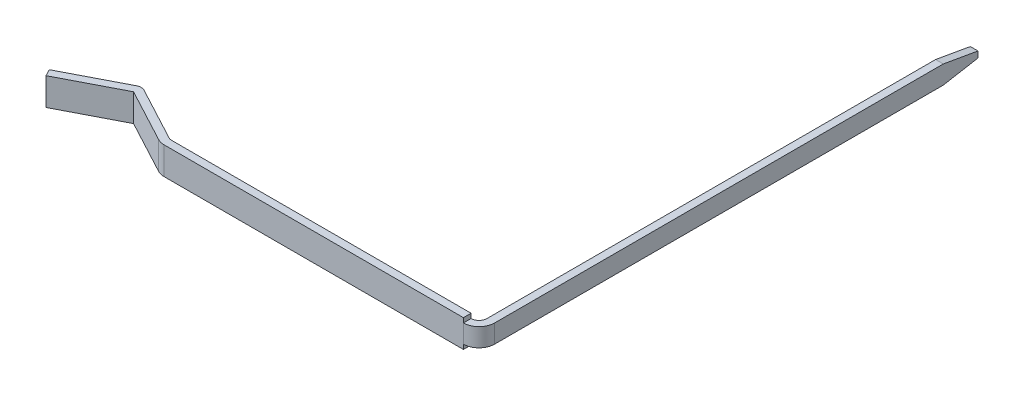
ISO-10303-21;
HEADER;
FILE_DESCRIPTION(('STEP AP214'),'2;1');
FILE_NAME('part.step','',(''),(''),'','','');
FILE_SCHEMA(('AUTOMOTIVE_DESIGN { 1 0 10303 214 1 1 1 1 }'));
ENDSEC;
DATA;
#1=APPLICATION_CONTEXT('core data for automotive mechanical design processes');
#2=APPLICATION_PROTOCOL_DEFINITION('international standard','automotive_design',2000,#1);
#3=PRODUCT_CONTEXT('',#1,'mechanical');
#4=PRODUCT('Part','Part','',(#3));
#5=PRODUCT_RELATED_PRODUCT_CATEGORY('part','',(#4));
#6=PRODUCT_DEFINITION_FORMATION('','',#4);
#7=PRODUCT_DEFINITION_CONTEXT('part definition',#1,'design');
#8=PRODUCT_DEFINITION('design','',#6,#7);
#9=PRODUCT_DEFINITION_SHAPE('','',#8);
#10=(LENGTH_UNIT() NAMED_UNIT(*) SI_UNIT(.MILLI.,.METRE.));
#11=(NAMED_UNIT(*) PLANE_ANGLE_UNIT() SI_UNIT($,.RADIAN.));
#12=(NAMED_UNIT(*) SI_UNIT($,.STERADIAN.) SOLID_ANGLE_UNIT());
#13=UNCERTAINTY_MEASURE_WITH_UNIT(LENGTH_MEASURE(1.E-05),#10,'distance_accuracy_value','');
#14=(GEOMETRIC_REPRESENTATION_CONTEXT(3) GLOBAL_UNCERTAINTY_ASSIGNED_CONTEXT((#13)) GLOBAL_UNIT_ASSIGNED_CONTEXT((#10,
#11,#12)) REPRESENTATION_CONTEXT('',''));
#15=CARTESIAN_POINT('',(0.,0.,0.));
#16=DIRECTION('',(0.,0.,1.));
#17=DIRECTION('',(1.,0.,0.));
#18=AXIS2_PLACEMENT_3D('',#15,#16,#17);
#19=CARTESIAN_POINT('',(5.145,-0.1,-7.89));
#20=DIRECTION('',(0.,0.,-1.));
#21=DIRECTION('',(0.,1.,0.));
#22=AXIS2_PLACEMENT_3D('',#19,#20,#21);
#23=PLANE('',#22);
#24=DIRECTION('',(0.,1.,0.));
#25=VECTOR('',#24,1.);
#26=CARTESIAN_POINT('',(5.395,0.,-7.89));
#27=LINE('',#26,#25);
#28=CARTESIAN_POINT('',(5.395,-0.099999999999998,-7.89));
#29=VERTEX_POINT('',#28);
#30=CARTESIAN_POINT('',(5.395,0.100000000000001,-7.89));
#31=VERTEX_POINT('',#30);
#32=EDGE_CURVE('E128',#29,#31,#27,.T.);
#33=ORIENTED_EDGE('',*,*,#32,.F.);
#34=DIRECTION('',(1.,0.,0.));
#35=VECTOR('',#34,1.);
#36=CARTESIAN_POINT('',(5.27,-0.1,-7.89));
#37=LINE('',#36,#35);
#38=CARTESIAN_POINT('',(5.145,-0.100000000000001,-7.89));
#39=VERTEX_POINT('',#38);
#40=EDGE_CURVE('E144',#39,#29,#37,.T.);
#41=ORIENTED_EDGE('',*,*,#40,.F.);
#42=DIRECTION('',(0.,-1.,0.));
#43=VECTOR('',#42,1.);
#44=CARTESIAN_POINT('',(5.145,0.,-7.89));
#45=LINE('',#44,#43);
#46=CARTESIAN_POINT('',(5.145,0.100000000000001,-7.89));
#47=VERTEX_POINT('',#46);
#48=EDGE_CURVE('E147',#47,#39,#45,.T.);
#49=ORIENTED_EDGE('',*,*,#48,.F.);
#50=DIRECTION('',(-1.,0.,0.));
#51=VECTOR('',#50,1.);
#52=CARTESIAN_POINT('',(5.27,0.1,-7.89));
#53=LINE('',#52,#51);
#54=EDGE_CURVE('E151',#31,#47,#53,.T.);
#55=ORIENTED_EDGE('',*,*,#54,.F.);
#56=EDGE_LOOP('',(#33,#41,#49,#55));
#57=FACE_BOUND('',#56,.T.);
#58=ADVANCED_FACE('F15',(#57),#23,.T.);
#59=CARTESIAN_POINT('',(5.395,-0.30000000000001,-6.75574363607643));
#60=DIRECTION('',(0.,-0.984807753012207,-0.173648177666935));
#61=DIRECTION('',(-1.,0.,0.));
#62=AXIS2_PLACEMENT_3D('',#59,#60,#61);
#63=PLANE('',#62);
#64=DIRECTION('',(0.,0.173648177666945,-0.984807753012205));
#65=VECTOR('',#64,1.);
#66=CARTESIAN_POINT('',(5.395,-0.3,-6.75574363607653));
#67=LINE('',#66,#65);
#68=CARTESIAN_POINT('',(5.395,-0.3,-6.75574363607652));
#69=VERTEX_POINT('',#68);
#70=EDGE_CURVE('E121',#69,#29,#67,.T.);
#71=ORIENTED_EDGE('',*,*,#70,.F.);
#72=DIRECTION('',(1.,0.,0.));
#73=VECTOR('',#72,1.);
#74=CARTESIAN_POINT('',(5.14,-0.3,-6.75574363607651));
#75=LINE('',#74,#73);
#76=CARTESIAN_POINT('',(5.145,-0.3,-6.75574363607645));
#77=VERTEX_POINT('',#76);
#78=EDGE_CURVE('E113',#77,#69,#75,.T.);
#79=ORIENTED_EDGE('',*,*,#78,.F.);
#80=DIRECTION('',(0.,-0.173648177666916,0.984807753012211));
#81=VECTOR('',#80,1.);
#82=CARTESIAN_POINT('',(5.145,-0.100000000000002,-7.89));
#83=LINE('',#82,#81);
#84=EDGE_CURVE('E141',#39,#77,#83,.T.);
#85=ORIENTED_EDGE('',*,*,#84,.F.);
#86=ORIENTED_EDGE('',*,*,#40,.T.);
#87=EDGE_LOOP('',(#71,#79,#85,#86));
#88=FACE_BOUND('',#87,.T.);
#89=ADVANCED_FACE('F234',(#88),#63,.T.);
#90=CARTESIAN_POINT('',(4.885,-0.3,8.49093446181646));
#91=DIRECTION('',(0.,-1.,0.));
#92=DIRECTION('',(0.,0.,-1.));
#93=AXIS2_PLACEMENT_3D('',#90,#91,#92);
#94=PLANE('',#93);
#95=DIRECTION('',(0.,0.,-1.));
#96=VECTOR('',#95,1.);
#97=CARTESIAN_POINT('',(4.885,-0.3,0.867595412869975));
#98=LINE('',#97,#96);
#99=CARTESIAN_POINT('',(4.885,-0.299999999999998,8.4));
#100=VERTEX_POINT('',#99);
#101=CARTESIAN_POINT('',(4.885,-0.299999999999999,8.15));
#102=VERTEX_POINT('',#101);
#103=EDGE_CURVE('E112',#100,#102,#98,.T.);
#104=ORIENTED_EDGE('',*,*,#103,.T.);
#105=CARTESIAN_POINT('',(4.885,-0.3,7.89));
#106=DIRECTION('',(0.,-1.,0.));
#107=DIRECTION('',(1.,0.,0.));
#108=AXIS2_PLACEMENT_3D('',#105,#106,#107);
#109=CIRCLE('',#108,0.260000000000001);
#110=CARTESIAN_POINT('',(5.145,-0.3,7.89));
#111=VERTEX_POINT('',#110);
#112=EDGE_CURVE('E131',#102,#111,#109,.F.);
#113=ORIENTED_EDGE('',*,*,#112,.T.);
#114=DIRECTION('',(0.,0.,1.));
#115=VECTOR('',#114,1.);
#116=CARTESIAN_POINT('',(5.145,-0.3,0.));
#117=LINE('',#116,#115);
#118=EDGE_CURVE('E137',#77,#111,#117,.T.);
#119=ORIENTED_EDGE('',*,*,#118,.F.);
#120=ORIENTED_EDGE('',*,*,#78,.T.);
#121=DIRECTION('',(0.,0.,-1.));
#122=VECTOR('',#121,1.);
#123=CARTESIAN_POINT('',(5.395,-0.3,0.));
#124=LINE('',#123,#122);
#125=CARTESIAN_POINT('',(5.395,-0.3,7.89));
#126=VERTEX_POINT('',#125);
#127=EDGE_CURVE('E115',#126,#69,#124,.T.);
#128=ORIENTED_EDGE('',*,*,#127,.F.);
#129=CARTESIAN_POINT('',(4.885,-0.3,7.89));
#130=DIRECTION('',(0.,-1.,0.));
#131=DIRECTION('',(0.,0.,-1.));
#132=AXIS2_PLACEMENT_3D('',#129,#130,#131);
#133=CIRCLE('',#132,0.510000000000001);
#134=EDGE_CURVE('E19',#126,#100,#133,.T.);
#135=ORIENTED_EDGE('',*,*,#134,.T.);
#136=EDGE_LOOP('',(#104,#113,#119,#120,#128,#135));
#137=FACE_BOUND('',#136,.T.);
#138=ADVANCED_FACE('F116',(#137),#94,.T.);
#139=CARTESIAN_POINT('',(5.395,-0.3,7.89));
#140=DIRECTION('',(1.,0.,0.));
#141=DIRECTION('',(0.,0.,-1.));
#142=AXIS2_PLACEMENT_3D('',#139,#140,#141);
#143=PLANE('',#142);
#144=ORIENTED_EDGE('',*,*,#127,.T.);
#145=ORIENTED_EDGE('',*,*,#70,.T.);
#146=ORIENTED_EDGE('',*,*,#32,.T.);
#147=DIRECTION('',(0.,-0.173648177666926,-0.984807753012209));
#148=VECTOR('',#147,1.);
#149=CARTESIAN_POINT('',(5.395,0.2,-7.32287181803822));
#150=LINE('',#149,#148);
#151=CARTESIAN_POINT('',(5.395,0.299999999999998,-6.75574363607646));
#152=VERTEX_POINT('',#151);
#153=EDGE_CURVE('E153',#152,#31,#150,.T.);
#154=ORIENTED_EDGE('',*,*,#153,.F.);
#155=DIRECTION('',(0.,0.,-1.));
#156=VECTOR('',#155,1.);
#157=CARTESIAN_POINT('',(5.395,0.3,0.86759541287));
#158=LINE('',#157,#156);
#159=CARTESIAN_POINT('',(5.395,0.3,7.89));
#160=VERTEX_POINT('',#159);
#161=EDGE_CURVE('E126',#160,#152,#158,.T.);
#162=ORIENTED_EDGE('',*,*,#161,.F.);
#163=DIRECTION('',(0.,-1.,0.));
#164=VECTOR('',#163,1.);
#165=CARTESIAN_POINT('',(5.395,0.,7.89));
#166=LINE('',#165,#164);
#167=EDGE_CURVE('E106',#160,#126,#166,.T.);
#168=ORIENTED_EDGE('',*,*,#167,.T.);
#169=EDGE_LOOP('',(#144,#145,#146,#154,#162,#168));
#170=FACE_BOUND('',#169,.T.);
#171=ADVANCED_FACE('F123',(#170),#143,.T.);
#172=CARTESIAN_POINT('',(5.395,0.1,-7.89));
#173=DIRECTION('',(0.,0.984807753012209,-0.173648177666926));
#174=DIRECTION('',(-1.,0.,0.));
#175=AXIS2_PLACEMENT_3D('',#172,#173,#174);
#176=PLANE('',#175);
#177=ORIENTED_EDGE('',*,*,#153,.T.);
#178=ORIENTED_EDGE('',*,*,#54,.T.);
#179=DIRECTION('',(0.,-0.173648177666916,-0.984807753012211));
#180=VECTOR('',#179,1.);
#181=CARTESIAN_POINT('',(5.145,0.3,-6.75574363607637));
#182=LINE('',#181,#180);
#183=CARTESIAN_POINT('',(5.145,0.299999999999996,-6.75574363607642));
#184=VERTEX_POINT('',#183);
#185=EDGE_CURVE('E150',#184,#47,#182,.T.);
#186=ORIENTED_EDGE('',*,*,#185,.F.);
#187=DIRECTION('',(-1.,0.,0.));
#188=VECTOR('',#187,1.);
#189=CARTESIAN_POINT('',(5.14,0.3,-6.75574363607646));
#190=LINE('',#189,#188);
#191=EDGE_CURVE('E243',#152,#184,#190,.T.);
#192=ORIENTED_EDGE('',*,*,#191,.F.);
#193=EDGE_LOOP('',(#177,#178,#186,#192));
#194=FACE_BOUND('',#193,.T.);
#195=ADVANCED_FACE('F241',(#194),#176,.T.);
#196=CARTESIAN_POINT('',(5.145,-0.3,-7.89));
#197=DIRECTION('',(-1.,0.,0.));
#198=DIRECTION('',(0.,0.,1.));
#199=AXIS2_PLACEMENT_3D('',#196,#197,#198);
#200=PLANE('',#199);
#201=ORIENTED_EDGE('',*,*,#118,.T.);
#202=DIRECTION('',(0.,1.,0.));
#203=VECTOR('',#202,1.);
#204=CARTESIAN_POINT('',(5.145,0.,7.89));
#205=LINE('',#204,#203);
#206=CARTESIAN_POINT('',(5.145,0.3,7.89));
#207=VERTEX_POINT('',#206);
#208=EDGE_CURVE('E140',#111,#207,#205,.T.);
#209=ORIENTED_EDGE('',*,*,#208,.T.);
#210=DIRECTION('',(0.,0.,1.));
#211=VECTOR('',#210,1.);
#212=CARTESIAN_POINT('',(5.145,0.3,0.86759541287));
#213=LINE('',#212,#211);
#214=EDGE_CURVE('E215',#184,#207,#213,.T.);
#215=ORIENTED_EDGE('',*,*,#214,.F.);
#216=ORIENTED_EDGE('',*,*,#185,.T.);
#217=ORIENTED_EDGE('',*,*,#48,.T.);
#218=ORIENTED_EDGE('',*,*,#84,.T.);
#219=EDGE_LOOP('',(#201,#209,#215,#216,#217,#218));
#220=FACE_BOUND('',#219,.T.);
#221=ADVANCED_FACE('F230',(#220),#200,.T.);
#222=CARTESIAN_POINT('',(4.885,0.3,-6.75574363607646));
#223=DIRECTION('',(0.,1.,0.));
#224=DIRECTION('',(0.,0.,1.));
#225=AXIS2_PLACEMENT_3D('',#222,#223,#224);
#226=PLANE('',#225);
#227=DIRECTION('',(0.,0.,-1.));
#228=VECTOR('',#227,1.);
#229=CARTESIAN_POINT('',(4.885,0.3,8.275));
#230=LINE('',#229,#228);
#231=CARTESIAN_POINT('',(4.885,0.299999999999999,8.4));
#232=VERTEX_POINT('',#231);
#233=CARTESIAN_POINT('',(4.885,0.299999999999999,8.15));
#234=VERTEX_POINT('',#233);
#235=EDGE_CURVE('E211',#232,#234,#230,.T.);
#236=ORIENTED_EDGE('',*,*,#235,.F.);
#237=CARTESIAN_POINT('',(4.885,0.3,7.89));
#238=DIRECTION('',(0.,-1.,0.));
#239=DIRECTION('',(0.,0.,-1.));
#240=AXIS2_PLACEMENT_3D('',#237,#238,#239);
#241=CIRCLE('',#240,0.510000000000001);
#242=EDGE_CURVE('E209',#160,#232,#241,.T.);
#243=ORIENTED_EDGE('',*,*,#242,.F.);
#244=ORIENTED_EDGE('',*,*,#161,.T.);
#245=ORIENTED_EDGE('',*,*,#191,.T.);
#246=ORIENTED_EDGE('',*,*,#214,.T.);
#247=CARTESIAN_POINT('',(4.885,0.3,7.89));
#248=DIRECTION('',(0.,-1.,0.));
#249=DIRECTION('',(1.,0.,0.));
#250=AXIS2_PLACEMENT_3D('',#247,#248,#249);
#251=CIRCLE('',#250,0.260000000000001);
#252=EDGE_CURVE('E212',#234,#207,#251,.F.);
#253=ORIENTED_EDGE('',*,*,#252,.F.);
#254=EDGE_LOOP('',(#236,#243,#244,#245,#246,#253));
#255=FACE_BOUND('',#254,.T.);
#256=ADVANCED_FACE('F423',(#255),#226,.T.);
#257=CARTESIAN_POINT('',(4.885,0.36,7.89));
#258=DIRECTION('',(0.,-1.,0.));
#259=DIRECTION('',(1.,0.,0.));
#260=AXIS2_PLACEMENT_3D('',#257,#258,#259);
#261=CYLINDRICAL_SURFACE('',#260,0.260000000000001);
#262=ORIENTED_EDGE('',*,*,#112,.F.);
#263=DIRECTION('',(0.,-1.,0.));
#264=VECTOR('',#263,1.);
#265=CARTESIAN_POINT('',(4.885,0.,8.15));
#266=LINE('',#265,#264);
#267=EDGE_CURVE('E252',#234,#102,#266,.T.);
#268=ORIENTED_EDGE('',*,*,#267,.F.);
#269=ORIENTED_EDGE('',*,*,#252,.T.);
#270=ORIENTED_EDGE('',*,*,#208,.F.);
#271=EDGE_LOOP('',(#262,#268,#269,#270));
#272=FACE_BOUND('',#271,.T.);
#273=ADVANCED_FACE('F225',(#272),#261,.F.);
#274=CARTESIAN_POINT('',(4.885,0.36,7.89));
#275=DIRECTION('',(0.,-1.,0.));
#276=DIRECTION('',(0.,0.,-1.));
#277=AXIS2_PLACEMENT_3D('',#274,#275,#276);
#278=CYLINDRICAL_SURFACE('',#277,0.510000000000001);
#279=DIRECTION('',(0.,1.,0.));
#280=VECTOR('',#279,1.);
#281=CARTESIAN_POINT('',(4.885,0.,8.4));
#282=LINE('',#281,#280);
#283=EDGE_CURVE('E109',#100,#232,#282,.T.);
#284=ORIENTED_EDGE('',*,*,#283,.F.);
#285=ORIENTED_EDGE('',*,*,#134,.F.);
#286=ORIENTED_EDGE('',*,*,#167,.F.);
#287=ORIENTED_EDGE('',*,*,#242,.T.);
#288=EDGE_LOOP('',(#284,#285,#286,#287));
#289=FACE_BOUND('',#288,.T.);
#290=ADVANCED_FACE('F103',(#289),#278,.T.);
#291=CARTESIAN_POINT('',(4.885,-0.45,8.4));
#292=DIRECTION('',(1.,0.,0.));
#293=DIRECTION('',(0.,0.,-1.));
#294=AXIS2_PLACEMENT_3D('',#291,#292,#293);
#295=PLANE('',#294);
#296=DIRECTION('',(0.,1.,0.));
#297=VECTOR('',#296,1.);
#298=CARTESIAN_POINT('',(4.885,0.,8.4));
#299=LINE('',#298,#297);
#300=CARTESIAN_POINT('',(4.885,-0.45,8.4));
#301=VERTEX_POINT('',#300);
#302=EDGE_CURVE('E258',#301,#100,#299,.T.);
#303=ORIENTED_EDGE('',*,*,#302,.F.);
#304=DIRECTION('',(0.,0.,1.));
#305=VECTOR('',#304,1.);
#306=CARTESIAN_POINT('',(4.885,-0.45,7.77124660035363));
#307=LINE('',#306,#305);
#308=CARTESIAN_POINT('',(4.885,-0.45,8.15));
#309=VERTEX_POINT('',#308);
#310=EDGE_CURVE('E268',#309,#301,#307,.T.);
#311=ORIENTED_EDGE('',*,*,#310,.F.);
#312=DIRECTION('',(0.,-1.,0.));
#313=VECTOR('',#312,1.);
#314=CARTESIAN_POINT('',(4.885,0.,8.15));
#315=LINE('',#314,#313);
#316=EDGE_CURVE('E254',#102,#309,#315,.T.);
#317=ORIENTED_EDGE('',*,*,#316,.F.);
#318=ORIENTED_EDGE('',*,*,#103,.F.);
#319=EDGE_LOOP('',(#303,#311,#317,#318));
#320=FACE_BOUND('',#319,.T.);
#321=ADVANCED_FACE('F407',(#320),#295,.T.);
#322=CARTESIAN_POINT('',(4.885,0.3,8.4));
#323=DIRECTION('',(1.,0.,0.));
#324=DIRECTION('',(0.,0.,-1.));
#325=AXIS2_PLACEMENT_3D('',#322,#323,#324);
#326=PLANE('',#325);
#327=ORIENTED_EDGE('',*,*,#235,.T.);
#328=DIRECTION('',(0.,-1.,0.));
#329=VECTOR('',#328,1.);
#330=CARTESIAN_POINT('',(4.885,0.,8.15));
#331=LINE('',#330,#329);
#332=CARTESIAN_POINT('',(4.88499999999999,0.45,8.15));
#333=VERTEX_POINT('',#332);
#334=EDGE_CURVE('E255',#333,#234,#331,.T.);
#335=ORIENTED_EDGE('',*,*,#334,.F.);
#336=DIRECTION('',(0.,0.,-1.));
#337=VECTOR('',#336,1.);
#338=CARTESIAN_POINT('',(4.88499999999999,0.45,8.40000000000001));
#339=LINE('',#338,#337);
#340=CARTESIAN_POINT('',(4.88499999999999,0.45,8.40000000000001));
#341=VERTEX_POINT('',#340);
#342=EDGE_CURVE('E186',#341,#333,#339,.T.);
#343=ORIENTED_EDGE('',*,*,#342,.F.);
#344=DIRECTION('',(0.,1.,0.));
#345=VECTOR('',#344,1.);
#346=CARTESIAN_POINT('',(4.885,0.,8.4));
#347=LINE('',#346,#345);
#348=EDGE_CURVE('E257',#232,#341,#347,.T.);
#349=ORIENTED_EDGE('',*,*,#348,.F.);
#350=EDGE_LOOP('',(#327,#335,#343,#349));
#351=FACE_BOUND('',#350,.T.);
#352=ADVANCED_FACE('F421',(#351),#326,.T.);
#353=CARTESIAN_POINT('',(4.885,-0.45,8.15));
#354=DIRECTION('',(0.,0.,-1.));
#355=DIRECTION('',(-1.,0.,0.));
#356=AXIS2_PLACEMENT_3D('',#353,#354,#355);
#357=PLANE('',#356);
#358=ORIENTED_EDGE('',*,*,#267,.T.);
#359=ORIENTED_EDGE('',*,*,#316,.T.);
#360=DIRECTION('',(1.,0.,0.));
#361=VECTOR('',#360,1.);
#362=CARTESIAN_POINT('',(-2.04131,-0.45,8.15));
#363=LINE('',#362,#361);
#364=CARTESIAN_POINT('',(-4.885,-0.45,8.15));
#365=VERTEX_POINT('',#364);
#366=EDGE_CURVE('E271',#365,#309,#363,.T.);
#367=ORIENTED_EDGE('',*,*,#366,.F.);
#368=DIRECTION('',(0.,-1.,0.));
#369=VECTOR('',#368,1.);
#370=CARTESIAN_POINT('',(-4.885,0.,8.15));
#371=LINE('',#370,#369);
#372=CARTESIAN_POINT('',(-4.885,0.45,8.15));
#373=VERTEX_POINT('',#372);
#374=EDGE_CURVE('E265',#373,#365,#371,.T.);
#375=ORIENTED_EDGE('',*,*,#374,.F.);
#376=DIRECTION('',(-1.,0.,0.));
#377=VECTOR('',#376,1.);
#378=CARTESIAN_POINT('',(4.88499999999999,0.45,8.14999999999999));
#379=LINE('',#378,#377);
#380=EDGE_CURVE('E183',#333,#373,#379,.T.);
#381=ORIENTED_EDGE('',*,*,#380,.F.);
#382=ORIENTED_EDGE('',*,*,#334,.T.);
#383=EDGE_LOOP('',(#358,#359,#367,#375,#381,#382));
#384=FACE_BOUND('',#383,.T.);
#385=ADVANCED_FACE('F403',(#384),#357,.T.);
#386=CARTESIAN_POINT('',(-4.885,0.540000000000003,7.89));
#387=DIRECTION('',(0.,-1.,0.));
#388=DIRECTION('',(0.,0.,-1.));
#389=AXIS2_PLACEMENT_3D('',#386,#387,#388);
#390=CYLINDRICAL_SURFACE('',#389,0.260000000000005);
#391=CARTESIAN_POINT('',(-4.885,0.450000000000003,7.88999999999999));
#392=DIRECTION('',(0.,-1.,0.));
#393=DIRECTION('',(0.,0.,-1.));
#394=AXIS2_PLACEMENT_3D('',#391,#392,#393);
#395=CIRCLE('',#394,0.260000000000005);
#396=CARTESIAN_POINT('',(-5.00761125591284,0.45,8.119273809938));
#397=VERTEX_POINT('',#396);
#398=EDGE_CURVE('E180',#373,#397,#395,.T.);
#399=ORIENTED_EDGE('',*,*,#398,.F.);
#400=ORIENTED_EDGE('',*,*,#374,.T.);
#401=CARTESIAN_POINT('',(-4.885,-0.449999999999997,7.88999999999999));
#402=DIRECTION('',(0.,-1.,0.));
#403=DIRECTION('',(0.,0.,-1.));
#404=AXIS2_PLACEMENT_3D('',#401,#402,#403);
#405=CIRCLE('',#404,0.260000000000005);
#406=CARTESIAN_POINT('',(-5.00761125591282,-0.45,8.11927380993798));
#407=VERTEX_POINT('',#406);
#408=EDGE_CURVE('E190',#407,#365,#405,.F.);
#409=ORIENTED_EDGE('',*,*,#408,.F.);
#410=DIRECTION('',(0.,-1.,0.));
#411=VECTOR('',#410,1.);
#412=CARTESIAN_POINT('',(-5.00761125591282,0.,8.11927380993799));
#413=LINE('',#412,#411);
#414=EDGE_CURVE('E284',#397,#407,#413,.T.);
#415=ORIENTED_EDGE('',*,*,#414,.F.);
#416=EDGE_LOOP('',(#399,#400,#409,#415));
#417=FACE_BOUND('',#416,.T.);
#418=ADVANCED_FACE('F400',(#417),#390,.F.);
#419=CARTESIAN_POINT('',(-5.00761125591282,-0.45,8.11927380993799));
#420=DIRECTION('',(0.471581753510866,0.,-0.88182234591533));
#421=DIRECTION('',(-0.88182234591533,0.,-0.471581753510866));
#422=AXIS2_PLACEMENT_3D('',#419,#420,#421);
#423=PLANE('',#422);
#424=DIRECTION('',(-0.881822345915313,0.,-0.471581753510899));
#425=VECTOR('',#424,1.);
#426=CARTESIAN_POINT('',(-5.00761125591286,0.45,8.11927380993801));
#427=LINE('',#426,#425);
#428=CARTESIAN_POINT('',(-6.76263722491789,0.45,7.18071943132168));
#429=VERTEX_POINT('',#428);
#430=EDGE_CURVE('E176',#397,#429,#427,.T.);
#431=ORIENTED_EDGE('',*,*,#430,.F.);
#432=ORIENTED_EDGE('',*,*,#414,.T.);
#433=DIRECTION('',(0.881822345915338,0.,0.471581753510852));
#434=VECTOR('',#433,1.);
#435=CARTESIAN_POINT('',(-6.7626372249179,-0.45,7.1807194313217));
#436=LINE('',#435,#434);
#437=CARTESIAN_POINT('',(-6.76263722491791,-0.45,7.1807194313217));
#438=VERTEX_POINT('',#437);
#439=EDGE_CURVE('E194',#438,#407,#436,.T.);
#440=ORIENTED_EDGE('',*,*,#439,.F.);
#441=DIRECTION('',(0.,1.,0.));
#442=VECTOR('',#441,1.);
#443=CARTESIAN_POINT('',(-6.7626372249179,0.,7.1807194313217));
#444=LINE('',#443,#442);
#445=EDGE_CURVE('E281',#438,#429,#444,.T.);
#446=ORIENTED_EDGE('',*,*,#445,.T.);
#447=EDGE_LOOP('',(#431,#432,#440,#446));
#448=FACE_BOUND('',#447,.T.);
#449=ADVANCED_FACE('F349',(#448),#423,.T.);
#450=CARTESIAN_POINT('',(-8.77029587643393,-0.45,8.37213276218726));
#451=DIRECTION('',(0.458816494264273,0.,0.888531048749025));
#452=DIRECTION('',(0.888531048749025,0.,-0.458816494264273));
#453=AXIS2_PLACEMENT_3D('',#450,#451,#452);
#454=PLANE('',#453);
#455=DIRECTION('',(0.888531048749026,0.,-0.458816494264271));
#456=VECTOR('',#455,1.);
#457=CARTESIAN_POINT('',(-3.30206123261474,0.45,5.54846525768767));
#458=LINE('',#457,#456);
#459=CARTESIAN_POINT('',(-8.77029587643394,0.45,8.37213276218725));
#460=VERTEX_POINT('',#459);
#461=CARTESIAN_POINT('',(-6.88983664577337,0.45,7.40110793077219));
#462=VERTEX_POINT('',#461);
#463=EDGE_CURVE('E175',#460,#462,#458,.T.);
#464=ORIENTED_EDGE('',*,*,#463,.F.);
#465=DIRECTION('',(0.,1.,0.));
#466=VECTOR('',#465,1.);
#467=CARTESIAN_POINT('',(-8.77029587643393,0.,8.37213276218726));
#468=LINE('',#467,#466);
#469=CARTESIAN_POINT('',(-8.77029587643393,-0.45,8.37213276218726));
#470=VERTEX_POINT('',#469);
#471=EDGE_CURVE('E189',#470,#460,#468,.T.);
#472=ORIENTED_EDGE('',*,*,#471,.F.);
#473=DIRECTION('',(-0.888531048749022,0.,0.458816494264278));
#474=VECTOR('',#473,1.);
#475=CARTESIAN_POINT('',(-6.8898366457734,-0.45,7.40110793077219));
#476=LINE('',#475,#474);
#477=CARTESIAN_POINT('',(-6.88983664577338,-0.45,7.40110793077219));
#478=VERTEX_POINT('',#477);
#479=EDGE_CURVE('E197',#478,#470,#476,.T.);
#480=ORIENTED_EDGE('',*,*,#479,.F.);
#481=DIRECTION('',(0.,-1.,0.));
#482=VECTOR('',#481,1.);
#483=CARTESIAN_POINT('',(-6.88983664577337,0.,7.4011079307722));
#484=LINE('',#483,#482);
#485=EDGE_CURVE('E287',#462,#478,#484,.T.);
#486=ORIENTED_EDGE('',*,*,#485,.F.);
#487=EDGE_LOOP('',(#464,#472,#480,#486));
#488=FACE_BOUND('',#487,.T.);
#489=ADVANCED_FACE('F395',(#488),#454,.T.);
#490=CARTESIAN_POINT('',(-6.88524848083072,0.54,7.40999324125975));
#491=DIRECTION('',(0.,-1.,0.));
#492=DIRECTION('',(0.,0.,-1.));
#493=AXIS2_PLACEMENT_3D('',#490,#491,#492);
#494=CYLINDRICAL_SURFACE('',#493,0.0100000000000578);
#495=CARTESIAN_POINT('',(-6.88524848083073,-0.45,7.40999324125969));
#496=DIRECTION('',(0.,-1.,0.));
#497=DIRECTION('',(0.,0.,-1.));
#498=AXIS2_PLACEMENT_3D('',#495,#496,#497);
#499=CIRCLE('',#498,0.0100000000000036);
#500=CARTESIAN_POINT('',(-6.8805326632956,-0.45,7.40117501780053));
#501=VERTEX_POINT('',#500);
#502=EDGE_CURVE('E199',#501,#478,#499,.F.);
#503=ORIENTED_EDGE('',*,*,#502,.F.);
#504=DIRECTION('',(0.,-1.,0.));
#505=VECTOR('',#504,1.);
#506=CARTESIAN_POINT('',(-6.88053266329562,0.,7.40117501780054));
#507=LINE('',#506,#505);
#508=CARTESIAN_POINT('',(-6.88053266329561,0.45,7.40117501780055));
#509=VERTEX_POINT('',#508);
#510=EDGE_CURVE('E293',#509,#501,#507,.T.);
#511=ORIENTED_EDGE('',*,*,#510,.F.);
#512=CARTESIAN_POINT('',(-6.88524848083072,0.45,7.40999324125975));
#513=DIRECTION('',(0.,1.,0.));
#514=DIRECTION('',(0.,0.,1.));
#515=AXIS2_PLACEMENT_3D('',#512,#513,#514);
#516=CIRCLE('',#515,0.0100000000000578);
#517=EDGE_CURVE('E172',#462,#509,#516,.F.);
#518=ORIENTED_EDGE('',*,*,#517,.F.);
#519=ORIENTED_EDGE('',*,*,#485,.T.);
#520=EDGE_LOOP('',(#503,#511,#518,#519));
#521=FACE_BOUND('',#520,.T.);
#522=ADVANCED_FACE('F390',(#521),#494,.F.);
#523=CARTESIAN_POINT('',(-6.88053266329562,-0.45,7.40117501780054));
#524=DIRECTION('',(-0.471581753510862,0.,0.881822345915333));
#525=DIRECTION('',(0.881822345915333,0.,0.471581753510862));
#526=AXIS2_PLACEMENT_3D('',#523,#524,#525);
#527=PLANE('',#526);
#528=DIRECTION('',(0.881822345915345,0.,0.47158175351084));
#529=VECTOR('',#528,1.);
#530=CARTESIAN_POINT('',(-6.88053266329559,0.45,7.40117501780056));
#531=LINE('',#530,#529);
#532=CARTESIAN_POINT('',(-5.12550669429052,0.45,8.33972939641681));
#533=VERTEX_POINT('',#532);
#534=EDGE_CURVE('E169',#509,#533,#531,.T.);
#535=ORIENTED_EDGE('',*,*,#534,.F.);
#536=ORIENTED_EDGE('',*,*,#510,.T.);
#537=DIRECTION('',(-0.881822345915323,0.,-0.471581753510881));
#538=VECTOR('',#537,1.);
#539=CARTESIAN_POINT('',(-5.12550669429056,-0.45,8.33972939641682));
#540=LINE('',#539,#538);
#541=CARTESIAN_POINT('',(-5.12550669429054,-0.45,8.33972939641682));
#542=VERTEX_POINT('',#541);
#543=EDGE_CURVE('E202',#542,#501,#540,.T.);
#544=ORIENTED_EDGE('',*,*,#543,.F.);
#545=DIRECTION('',(0.,-1.,0.));
#546=VECTOR('',#545,1.);
#547=CARTESIAN_POINT('',(-5.12550669429054,0.,8.33972939641682));
#548=LINE('',#547,#546);
#549=EDGE_CURVE('E276',#533,#542,#548,.T.);
#550=ORIENTED_EDGE('',*,*,#549,.F.);
#551=EDGE_LOOP('',(#535,#536,#544,#550));
#552=FACE_BOUND('',#551,.T.);
#553=ADVANCED_FACE('F418',(#552),#527,.T.);
#554=CARTESIAN_POINT('',(-4.88499999999999,0.54,7.89000000000001));
#555=DIRECTION('',(0.,-1.,0.));
#556=DIRECTION('',(0.,0.,-1.));
#557=AXIS2_PLACEMENT_3D('',#554,#555,#556);
#558=CYLINDRICAL_SURFACE('',#557,0.509999999999999);
#559=CARTESIAN_POINT('',(-4.88499999999999,0.45,7.89000000000001));
#560=DIRECTION('',(0.,1.,0.));
#561=DIRECTION('',(0.,0.,1.));
#562=AXIS2_PLACEMENT_3D('',#559,#560,#561);
#563=CIRCLE('',#562,0.509999999999999);
#564=CARTESIAN_POINT('',(-4.88499999999999,0.45,8.40000000000001));
#565=VERTEX_POINT('',#564);
#566=EDGE_CURVE('E166',#533,#565,#563,.T.);
#567=ORIENTED_EDGE('',*,*,#566,.F.);
#568=ORIENTED_EDGE('',*,*,#549,.T.);
#569=CARTESIAN_POINT('',(-4.88499999999999,-0.45,7.89000000000001));
#570=DIRECTION('',(0.,-1.,0.));
#571=DIRECTION('',(0.,0.,-1.));
#572=AXIS2_PLACEMENT_3D('',#569,#570,#571);
#573=CIRCLE('',#572,0.509999999999999);
#574=CARTESIAN_POINT('',(-4.88499999999999,-0.45,8.4));
#575=VERTEX_POINT('',#574);
#576=EDGE_CURVE('E205',#575,#542,#573,.T.);
#577=ORIENTED_EDGE('',*,*,#576,.F.);
#578=DIRECTION('',(0.,-1.,0.));
#579=VECTOR('',#578,1.);
#580=CARTESIAN_POINT('',(-4.885,0.,8.4));
#581=LINE('',#580,#579);
#582=EDGE_CURVE('E303',#565,#575,#581,.T.);
#583=ORIENTED_EDGE('',*,*,#582,.F.);
#584=EDGE_LOOP('',(#567,#568,#577,#583));
#585=FACE_BOUND('',#584,.T.);
#586=ADVANCED_FACE('F415',(#585),#558,.T.);
#587=CARTESIAN_POINT('',(-4.885,-0.45,8.4));
#588=DIRECTION('',(0.,0.,1.));
#589=DIRECTION('',(1.,0.,0.));
#590=AXIS2_PLACEMENT_3D('',#587,#588,#589);
#591=PLANE('',#590);
#592=DIRECTION('',(1.,0.,0.));
#593=VECTOR('',#592,1.);
#594=CARTESIAN_POINT('',(-4.88499999999997,0.45,8.40000000000002));
#595=LINE('',#594,#593);
#596=EDGE_CURVE('E163',#565,#341,#595,.T.);
#597=ORIENTED_EDGE('',*,*,#596,.F.);
#598=ORIENTED_EDGE('',*,*,#582,.T.);
#599=DIRECTION('',(-1.,0.,0.));
#600=VECTOR('',#599,1.);
#601=CARTESIAN_POINT('',(-2.04131,-0.45,8.4));
#602=LINE('',#601,#600);
#603=EDGE_CURVE('E208',#301,#575,#602,.T.);
#604=ORIENTED_EDGE('',*,*,#603,.F.);
#605=ORIENTED_EDGE('',*,*,#302,.T.);
#606=ORIENTED_EDGE('',*,*,#283,.T.);
#607=ORIENTED_EDGE('',*,*,#348,.T.);
#608=EDGE_LOOP('',(#597,#598,#604,#605,#606,#607));
#609=FACE_BOUND('',#608,.T.);
#610=ADVANCED_FACE('F412',(#609),#591,.T.);
#611=CARTESIAN_POINT('',(-8.96762,-0.45,8.4));
#612=DIRECTION('',(0.,-1.,0.));
#613=DIRECTION('',(0.,0.,-1.));
#614=AXIS2_PLACEMENT_3D('',#611,#612,#613);
#615=PLANE('',#614);
#616=ORIENTED_EDGE('',*,*,#439,.T.);
#617=ORIENTED_EDGE('',*,*,#408,.T.);
#618=ORIENTED_EDGE('',*,*,#366,.T.);
#619=ORIENTED_EDGE('',*,*,#310,.T.);
#620=ORIENTED_EDGE('',*,*,#603,.T.);
#621=ORIENTED_EDGE('',*,*,#576,.T.);
#622=ORIENTED_EDGE('',*,*,#543,.T.);
#623=ORIENTED_EDGE('',*,*,#502,.T.);
#624=ORIENTED_EDGE('',*,*,#479,.T.);
#625=DIRECTION('',(0.45881649426427,0.,0.888531048749027));
#626=VECTOR('',#625,1.);
#627=CARTESIAN_POINT('',(-8.82764793821697,-0.45,8.26106638109363));
#628=LINE('',#627,#626);
#629=CARTESIAN_POINT('',(-8.885,-0.45,8.15));
#630=VERTEX_POINT('',#629);
#631=EDGE_CURVE('E193',#630,#470,#628,.T.);
#632=ORIENTED_EDGE('',*,*,#631,.F.);
#633=DIRECTION('',(-0.888531048749025,0.,0.458816494264272));
#634=VECTOR('',#633,1.);
#635=CARTESIAN_POINT('',(-7.94477038466972,-0.45,7.66448758429247));
#636=LINE('',#635,#634);
#637=CARTESIAN_POINT('',(-7.00454076933943,-0.45,7.17897516858494));
#638=VERTEX_POINT('',#637);
#639=EDGE_CURVE('E159',#638,#630,#636,.T.);
#640=ORIENTED_EDGE('',*,*,#639,.F.);
#641=CARTESIAN_POINT('',(-6.88524848083072,-0.449999999999997,7.40999324125966));
#642=DIRECTION('',(0.,-1.,0.));
#643=DIRECTION('',(0.,0.,-1.));
#644=AXIS2_PLACEMENT_3D('',#641,#642,#643);
#645=CIRCLE('',#644,0.259999999999964);
#646=EDGE_CURVE('E33',#438,#638,#645,.F.);
#647=ORIENTED_EDGE('',*,*,#646,.F.);
#648=EDGE_LOOP('',(#616,#617,#618,#619,#620,#621,#622,#623,#624,#632,#640,#647));
#649=FACE_BOUND('',#648,.T.);
#650=ADVANCED_FACE('F399',(#649),#615,.T.);
#651=CARTESIAN_POINT('',(-8.885,0.45,8.15));
#652=DIRECTION('',(-0.888531048749027,0.,0.45881649426427));
#653=DIRECTION('',(0.,-1.,0.));
#654=AXIS2_PLACEMENT_3D('',#651,#652,#653);
#655=PLANE('',#654);
#656=ORIENTED_EDGE('',*,*,#631,.T.);
#657=ORIENTED_EDGE('',*,*,#471,.T.);
#658=DIRECTION('',(0.458816494264271,0.,0.888531048749026));
#659=VECTOR('',#658,1.);
#660=CARTESIAN_POINT('',(-7.37565980168958,0.45,11.0729455481419));
#661=LINE('',#660,#659);
#662=CARTESIAN_POINT('',(-8.885,0.45,8.15));
#663=VERTEX_POINT('',#662);
#664=EDGE_CURVE('E179',#663,#460,#661,.T.);
#665=ORIENTED_EDGE('',*,*,#664,.F.);
#666=DIRECTION('',(0.,1.,0.));
#667=VECTOR('',#666,1.);
#668=CARTESIAN_POINT('',(-8.885,0.,8.15));
#669=LINE('',#668,#667);
#670=EDGE_CURVE('E317',#630,#663,#669,.T.);
#671=ORIENTED_EDGE('',*,*,#670,.F.);
#672=EDGE_LOOP('',(#656,#657,#665,#671));
#673=FACE_BOUND('',#672,.T.);
#674=ADVANCED_FACE('F398',(#673),#655,.T.);
#675=CARTESIAN_POINT('',(2.05146928763839,0.45,2.50266499100084));
#676=DIRECTION('',(0.,1.,0.));
#677=DIRECTION('',(-0.888531048749026,0.,0.458816494264271));
#678=AXIS2_PLACEMENT_3D('',#675,#676,#677);
#679=PLANE('',#678);
#680=ORIENTED_EDGE('',*,*,#566,.T.);
#681=ORIENTED_EDGE('',*,*,#596,.T.);
#682=ORIENTED_EDGE('',*,*,#342,.T.);
#683=ORIENTED_EDGE('',*,*,#380,.T.);
#684=ORIENTED_EDGE('',*,*,#398,.T.);
#685=ORIENTED_EDGE('',*,*,#430,.T.);
#686=CARTESIAN_POINT('',(-6.88524848083072,0.450000000000003,7.40999324125965));
#687=DIRECTION('',(0.,-1.,0.));
#688=DIRECTION('',(0.,0.,-1.));
#689=AXIS2_PLACEMENT_3D('',#686,#687,#688);
#690=CIRCLE('',#689,0.259999999999964);
#691=CARTESIAN_POINT('',(-7.00454076933943,0.45,7.17897516858494));
#692=VERTEX_POINT('',#691);
#693=EDGE_CURVE('E160',#692,#429,#690,.T.);
#694=ORIENTED_EDGE('',*,*,#693,.F.);
#695=DIRECTION('',(0.888531048749025,0.,-0.458816494264272));
#696=VECTOR('',#695,1.);
#697=CARTESIAN_POINT('',(-7.94477038466972,0.45,7.66448758429247));
#698=LINE('',#697,#696);
#699=EDGE_CURVE('E25',#663,#692,#698,.T.);
#700=ORIENTED_EDGE('',*,*,#699,.F.);
#701=ORIENTED_EDGE('',*,*,#664,.T.);
#702=ORIENTED_EDGE('',*,*,#463,.T.);
#703=ORIENTED_EDGE('',*,*,#517,.T.);
#704=ORIENTED_EDGE('',*,*,#534,.T.);
#705=EDGE_LOOP('',(#680,#681,#682,#683,#684,#685,#694,#700,#701,#702,#703,#704));
#706=FACE_BOUND('',#705,.T.);
#707=ADVANCED_FACE('F344',(#706),#679,.T.);
#708=CARTESIAN_POINT('',(-7.00454076933944,-0.45,7.17897516858494));
#709=DIRECTION('',(-0.458816494264272,0.,-0.888531048749025));
#710=DIRECTION('',(-0.888531048749025,0.,0.458816494264272));
#711=AXIS2_PLACEMENT_3D('',#708,#709,#710);
#712=PLANE('',#711);
#713=ORIENTED_EDGE('',*,*,#699,.T.);
#714=DIRECTION('',(0.,1.,0.));
#715=VECTOR('',#714,1.);
#716=CARTESIAN_POINT('',(-7.00454076933944,0.,7.17897516858495));
#717=LINE('',#716,#715);
#718=EDGE_CURVE('E10',#638,#692,#717,.T.);
#719=ORIENTED_EDGE('',*,*,#718,.F.);
#720=ORIENTED_EDGE('',*,*,#639,.T.);
#721=ORIENTED_EDGE('',*,*,#670,.T.);
#722=EDGE_LOOP('',(#713,#719,#720,#721));
#723=FACE_BOUND('',#722,.T.);
#724=ADVANCED_FACE('F336',(#723),#712,.T.);
#725=CARTESIAN_POINT('',(-6.88524848083072,0.539999999999997,7.40999324125969));
#726=DIRECTION('',(0.,-1.,0.));
#727=DIRECTION('',(0.,0.,-1.));
#728=AXIS2_PLACEMENT_3D('',#725,#726,#727);
#729=CYLINDRICAL_SURFACE('',#728,0.259999999999997);
#730=ORIENTED_EDGE('',*,*,#646,.T.);
#731=ORIENTED_EDGE('',*,*,#718,.T.);
#732=ORIENTED_EDGE('',*,*,#693,.T.);
#733=ORIENTED_EDGE('',*,*,#445,.F.);
#734=EDGE_LOOP('',(#730,#731,#732,#733));
#735=FACE_BOUND('',#734,.T.);
#736=ADVANCED_FACE('F17',(#735),#729,.T.);
#737=CLOSED_SHELL('',(#58,#89,#138,#171,#195,#221,#256,#273,#290,#321,#352,#385,#418,#449,#489,
#522,#553,#586,#610,#650,#674,#707,#724,#736));
#738=MANIFOLD_SOLID_BREP('B1',#737);
#739=ADVANCED_BREP_SHAPE_REPRESENTATION('',(#18,#738),#14);
#740=SHAPE_DEFINITION_REPRESENTATION(#9,#739);
ENDSEC;
END-ISO-10303-21;
